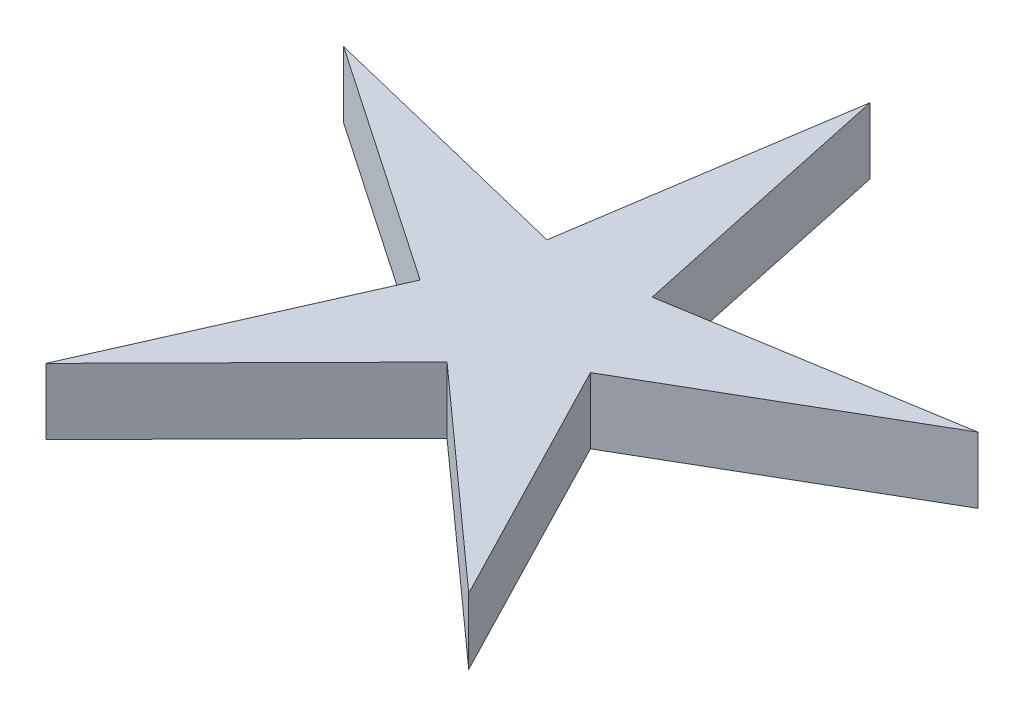
ISO-10303-21;
HEADER;
FILE_DESCRIPTION(('STEP AP214'),'2;1');
FILE_NAME('part.step','',(''),(''),'','','');
FILE_SCHEMA(('AUTOMOTIVE_DESIGN { 1 0 10303 214 1 1 1 1 }'));
ENDSEC;
DATA;
#1=APPLICATION_CONTEXT('core data for automotive mechanical design processes');
#2=APPLICATION_PROTOCOL_DEFINITION('international standard','automotive_design',2000,#1);
#3=PRODUCT_CONTEXT('',#1,'mechanical');
#4=PRODUCT('Part','Part','',(#3));
#5=PRODUCT_RELATED_PRODUCT_CATEGORY('part','',(#4));
#6=PRODUCT_DEFINITION_FORMATION('','',#4);
#7=PRODUCT_DEFINITION_CONTEXT('part definition',#1,'design');
#8=PRODUCT_DEFINITION('design','',#6,#7);
#9=PRODUCT_DEFINITION_SHAPE('','',#8);
#10=(LENGTH_UNIT() NAMED_UNIT(*) SI_UNIT(.MILLI.,.METRE.));
#11=(NAMED_UNIT(*) PLANE_ANGLE_UNIT() SI_UNIT($,.RADIAN.));
#12=(NAMED_UNIT(*) SI_UNIT($,.STERADIAN.) SOLID_ANGLE_UNIT());
#13=UNCERTAINTY_MEASURE_WITH_UNIT(LENGTH_MEASURE(1.E-05),#10,'distance_accuracy_value','');
#14=(GEOMETRIC_REPRESENTATION_CONTEXT(3) GLOBAL_UNCERTAINTY_ASSIGNED_CONTEXT((#13)) GLOBAL_UNIT_ASSIGNED_CONTEXT((#10,
#11,#12)) REPRESENTATION_CONTEXT('',''));
#15=CARTESIAN_POINT('',(0.,0.,0.));
#16=DIRECTION('',(0.,0.,1.));
#17=DIRECTION('',(1.,0.,0.));
#18=AXIS2_PLACEMENT_3D('',#15,#16,#17);
#19=CARTESIAN_POINT('',(66.4840473280508,10.,30.82949304793));
#20=DIRECTION('',(-0.888351621109785,0.,0.45916380222271));
#21=DIRECTION('',(0.45916380222271,0.,0.888351621109785));
#22=AXIS2_PLACEMENT_3D('',#19,#20,#21);
#23=PLANE('',#22);
#24=DIRECTION('',(-0.45916380222271,0.,-0.888351621109785));
#25=VECTOR('',#24,1.);
#26=CARTESIAN_POINT('',(66.4840473280508,0.,30.82949304793));
#27=LINE('',#26,#25);
#28=CARTESIAN_POINT('',(66.4840473280508,0.,30.82949304793));
#29=VERTEX_POINT('',#28);
#30=CARTESIAN_POINT('',(46.7631117785742,0.,-7.32491934340591));
#31=VERTEX_POINT('',#30);
#32=EDGE_CURVE('E156',#29,#31,#27,.T.);
#33=ORIENTED_EDGE('',*,*,#32,.T.);
#34=DIRECTION('',(0.,-1.,0.));
#35=VECTOR('',#34,1.);
#36=CARTESIAN_POINT('',(46.7631117785742,10.,-7.32491934340591));
#37=LINE('',#36,#35);
#38=CARTESIAN_POINT('',(46.7631117785742,10.,-7.32491934340591));
#39=VERTEX_POINT('',#38);
#40=EDGE_CURVE('E11',#39,#31,#37,.T.);
#41=ORIENTED_EDGE('',*,*,#40,.F.);
#42=DIRECTION('',(-0.45916380222271,0.,-0.888351621109785));
#43=VECTOR('',#42,1.);
#44=CARTESIAN_POINT('',(66.4840473280508,10.,30.82949304793));
#45=LINE('',#44,#43);
#46=CARTESIAN_POINT('',(66.4840473280508,10.,30.82949304793));
#47=VERTEX_POINT('',#46);
#48=EDGE_CURVE('E184',#47,#39,#45,.T.);
#49=ORIENTED_EDGE('',*,*,#48,.F.);
#50=DIRECTION('',(0.,-1.,0.));
#51=VECTOR('',#50,1.);
#52=CARTESIAN_POINT('',(66.4840473280508,10.,30.82949304793));
#53=LINE('',#52,#51);
#54=EDGE_CURVE('E152',#47,#29,#53,.T.);
#55=ORIENTED_EDGE('',*,*,#54,.T.);
#56=EDGE_LOOP('',(#33,#41,#49,#55));
#57=FACE_BOUND('',#56,.T.);
#58=ADVANCED_FACE('F43',(#57),#23,.F.);
#59=CARTESIAN_POINT('',(46.7631117785742,10.,-7.32491934340591));
#60=DIRECTION('',(-0.501563585968425,0.,-0.865120783030031));
#61=DIRECTION('',(-0.865120783030031,0.,0.501563585968425));
#62=AXIS2_PLACEMENT_3D('',#59,#60,#61);
#63=PLANE('',#62);
#64=DIRECTION('',(0.865120783030031,0.,-0.501563585968425));
#65=VECTOR('',#64,1.);
#66=CARTESIAN_POINT('',(46.7631117785742,0.,-7.32491934340591));
#67=LINE('',#66,#65);
#68=CARTESIAN_POINT('',(83.9197672511082,0.,-28.8669117760978));
#69=VERTEX_POINT('',#68);
#70=EDGE_CURVE('E160',#31,#69,#67,.T.);
#71=ORIENTED_EDGE('',*,*,#70,.T.);
#72=DIRECTION('',(0.,-1.,0.));
#73=VECTOR('',#72,1.);
#74=CARTESIAN_POINT('',(83.9197672511082,10.,-28.8669117760978));
#75=LINE('',#74,#73);
#76=CARTESIAN_POINT('',(83.9197672511082,10.,-28.8669117760978));
#77=VERTEX_POINT('',#76);
#78=EDGE_CURVE('E52',#77,#69,#75,.T.);
#79=ORIENTED_EDGE('',*,*,#78,.F.);
#80=DIRECTION('',(0.865120783030031,0.,-0.501563585968425));
#81=VECTOR('',#80,1.);
#82=CARTESIAN_POINT('',(46.7631117785742,10.,-7.32491934340591));
#83=LINE('',#82,#81);
#84=EDGE_CURVE('E109',#39,#77,#83,.T.);
#85=ORIENTED_EDGE('',*,*,#84,.F.);
#86=ORIENTED_EDGE('',*,*,#40,.T.);
#87=EDGE_LOOP('',(#71,#79,#85,#86));
#88=FACE_BOUND('',#87,.T.);
#89=ADVANCED_FACE('F248',(#88),#63,.F.);
#90=CARTESIAN_POINT('',(83.9197672511082,10.,-28.8669117760978));
#91=DIRECTION('',(0.16217497824731,0.,0.98676201610646));
#92=DIRECTION('',(0.98676201610646,0.,-0.16217497824731));
#93=AXIS2_PLACEMENT_3D('',#90,#91,#92);
#94=PLANE('',#93);
#95=DIRECTION('',(-0.98676201610646,0.,0.16217497824731));
#96=VECTOR('',#95,1.);
#97=CARTESIAN_POINT('',(83.9197672511082,0.,-28.8669117760978));
#98=LINE('',#97,#96);
#99=CARTESIAN_POINT('',(41.5386604911542,0.,-21.9015493536442));
#100=VERTEX_POINT('',#99);
#101=EDGE_CURVE('E163',#69,#100,#98,.T.);
#102=ORIENTED_EDGE('',*,*,#101,.T.);
#103=DIRECTION('',(0.,-1.,0.));
#104=VECTOR('',#103,1.);
#105=CARTESIAN_POINT('',(41.5386604911542,10.,-21.9015493536442));
#106=LINE('',#105,#104);
#107=CARTESIAN_POINT('',(41.5386604911542,10.,-21.9015493536442));
#108=VERTEX_POINT('',#107);
#109=EDGE_CURVE('E203',#108,#100,#106,.T.);
#110=ORIENTED_EDGE('',*,*,#109,.F.);
#111=DIRECTION('',(-0.98676201610646,0.,0.16217497824731));
#112=VECTOR('',#111,1.);
#113=CARTESIAN_POINT('',(83.9197672511082,10.,-28.8669117760978));
#114=LINE('',#113,#112);
#115=EDGE_CURVE('E213',#77,#108,#114,.T.);
#116=ORIENTED_EDGE('',*,*,#115,.F.);
#117=ORIENTED_EDGE('',*,*,#78,.T.);
#118=EDGE_LOOP('',(#102,#110,#116,#117));
#119=FACE_BOUND('',#118,.T.);
#120=ADVANCED_FACE('F211',(#119),#94,.F.);
#121=CARTESIAN_POINT('',(41.5386604911542,10.,-21.9015493536442));
#122=DIRECTION('',(-0.97777042990696,0.,0.209678292628393));
#123=DIRECTION('',(0.209678292628393,0.,0.97777042990696));
#124=AXIS2_PLACEMENT_3D('',#121,#122,#123);
#125=PLANE('',#124);
#126=DIRECTION('',(-0.209678292628393,0.,-0.97777042990696));
#127=VECTOR('',#126,1.);
#128=CARTESIAN_POINT('',(41.5386604911542,0.,-21.9015493536442));
#129=LINE('',#128,#127);
#130=CARTESIAN_POINT('',(32.5330462092096,0.,-63.8964704189299));
#131=VERTEX_POINT('',#130);
#132=EDGE_CURVE('E166',#100,#131,#129,.T.);
#133=ORIENTED_EDGE('',*,*,#132,.T.);
#134=DIRECTION('',(0.,-1.,0.));
#135=VECTOR('',#134,1.);
#136=CARTESIAN_POINT('',(32.5330462092096,10.,-63.8964704189299));
#137=LINE('',#136,#135);
#138=CARTESIAN_POINT('',(32.5330462092096,10.,-63.8964704189299));
#139=VERTEX_POINT('',#138);
#140=EDGE_CURVE('E199',#139,#131,#137,.T.);
#141=ORIENTED_EDGE('',*,*,#140,.F.);
#142=DIRECTION('',(-0.209678292628393,0.,-0.97777042990696));
#143=VECTOR('',#142,1.);
#144=CARTESIAN_POINT('',(41.5386604911542,10.,-21.9015493536442));
#145=LINE('',#144,#143);
#146=EDGE_CURVE('E232',#108,#139,#145,.T.);
#147=ORIENTED_EDGE('',*,*,#146,.F.);
#148=ORIENTED_EDGE('',*,*,#109,.T.);
#149=EDGE_LOOP('',(#133,#141,#147,#148));
#150=FACE_BOUND('',#149,.T.);
#151=ADVANCED_FACE('F222',(#150),#125,.F.);
#152=CARTESIAN_POINT('',(32.5330462092096,10.,-63.8964704189299));
#153=DIRECTION('',(0.988581269791398,0.,0.150688662538453));
#154=DIRECTION('',(0.150688662538453,0.,-0.988581269791398));
#155=AXIS2_PLACEMENT_3D('',#152,#153,#154);
#156=PLANE('',#155);
#157=DIRECTION('',(-0.150688662538453,0.,0.988581269791398));
#158=VECTOR('',#157,1.);
#159=CARTESIAN_POINT('',(32.5330462092096,0.,-63.8964704189299));
#160=LINE('',#159,#158);
#161=CARTESIAN_POINT('',(26.0610173001967,0.,-21.4372273065564));
#162=VERTEX_POINT('',#161);
#163=EDGE_CURVE('E169',#131,#162,#160,.T.);
#164=ORIENTED_EDGE('',*,*,#163,.T.);
#165=DIRECTION('',(0.,-1.,0.));
#166=VECTOR('',#165,1.);
#167=CARTESIAN_POINT('',(26.0610173001967,10.,-21.4372273065564));
#168=LINE('',#167,#166);
#169=CARTESIAN_POINT('',(26.0610173001967,10.,-21.4372273065564));
#170=VERTEX_POINT('',#169);
#171=EDGE_CURVE('E195',#170,#162,#168,.T.);
#172=ORIENTED_EDGE('',*,*,#171,.F.);
#173=DIRECTION('',(-0.150688662538453,0.,0.988581269791398));
#174=VECTOR('',#173,1.);
#175=CARTESIAN_POINT('',(32.5330462092096,10.,-63.8964704189299));
#176=LINE('',#175,#174);
#177=EDGE_CURVE('E228',#139,#170,#176,.T.);
#178=ORIENTED_EDGE('',*,*,#177,.F.);
#179=ORIENTED_EDGE('',*,*,#140,.T.);
#180=EDGE_LOOP('',(#164,#172,#178,#179));
#181=FACE_BOUND('',#180,.T.);
#182=ADVANCED_FACE('F226',(#181),#156,.F.);
#183=CARTESIAN_POINT('',(26.0610173001967,10.,-21.4372273065564));
#184=DIRECTION('',(-0.237430704479935,0.,0.971404478356036));
#185=DIRECTION('',(0.971404478356036,0.,0.237430704479935));
#186=AXIS2_PLACEMENT_3D('',#183,#184,#185);
#187=PLANE('',#186);
#188=DIRECTION('',(-0.971404478356036,0.,-0.237430704479935));
#189=VECTOR('',#188,1.);
#190=CARTESIAN_POINT('',(26.0610173001967,0.,-21.4372273065564));
#191=LINE('',#190,#189);
#192=CARTESIAN_POINT('',(-14.6990873678906,0.,-31.3998130076209));
#193=VERTEX_POINT('',#192);
#194=EDGE_CURVE('E172',#162,#193,#191,.T.);
#195=ORIENTED_EDGE('',*,*,#194,.T.);
#196=DIRECTION('',(0.,-1.,0.));
#197=VECTOR('',#196,1.);
#198=CARTESIAN_POINT('',(-14.6990873678906,10.,-31.3998130076209));
#199=LINE('',#198,#197);
#200=CARTESIAN_POINT('',(-14.6990873678906,10.,-31.3998130076209));
#201=VERTEX_POINT('',#200);
#202=EDGE_CURVE('E191',#201,#193,#199,.T.);
#203=ORIENTED_EDGE('',*,*,#202,.F.);
#204=DIRECTION('',(-0.971404478356036,0.,-0.237430704479935));
#205=VECTOR('',#204,1.);
#206=CARTESIAN_POINT('',(26.0610173001967,10.,-21.4372273065564));
#207=LINE('',#206,#205);
#208=EDGE_CURVE('E231',#170,#201,#207,.T.);
#209=ORIENTED_EDGE('',*,*,#208,.F.);
#210=ORIENTED_EDGE('',*,*,#171,.T.);
#211=EDGE_LOOP('',(#195,#203,#209,#210));
#212=FACE_BOUND('',#211,.T.);
#213=ADVANCED_FACE('F260',(#212),#187,.F.);
#214=CARTESIAN_POINT('',(-14.6990873678906,10.,-31.3998130076209));
#215=DIRECTION('',(0.563261718489381,0.,-0.826278546547343));
#216=DIRECTION('',(-0.826278546547343,0.,-0.563261718489381));
#217=AXIS2_PLACEMENT_3D('',#214,#215,#216);
#218=PLANE('',#217);
#219=DIRECTION('',(0.826278546547343,0.,0.563261718489381));
#220=VECTOR('',#219,1.);
#221=CARTESIAN_POINT('',(-14.6990873678906,0.,-31.3998130076209));
#222=LINE('',#221,#220);
#223=CARTESIAN_POINT('',(21.7197590298616,0.,-6.5736304894918));
#224=VERTEX_POINT('',#223);
#225=EDGE_CURVE('E175',#193,#224,#222,.T.);
#226=ORIENTED_EDGE('',*,*,#225,.T.);
#227=DIRECTION('',(0.,-1.,0.));
#228=VECTOR('',#227,1.);
#229=CARTESIAN_POINT('',(21.7197590298616,10.,-6.5736304894918));
#230=LINE('',#229,#228);
#231=CARTESIAN_POINT('',(21.7197590298616,10.,-6.5736304894918));
#232=VERTEX_POINT('',#231);
#233=EDGE_CURVE('E145',#232,#224,#230,.T.);
#234=ORIENTED_EDGE('',*,*,#233,.F.);
#235=DIRECTION('',(0.826278546547343,0.,0.563261718489381));
#236=VECTOR('',#235,1.);
#237=CARTESIAN_POINT('',(-14.6990873678906,10.,-31.3998130076209));
#238=LINE('',#237,#236);
#239=EDGE_CURVE('E134',#201,#232,#238,.T.);
#240=ORIENTED_EDGE('',*,*,#239,.F.);
#241=ORIENTED_EDGE('',*,*,#202,.T.);
#242=EDGE_LOOP('',(#226,#234,#240,#241));
#243=FACE_BOUND('',#242,.T.);
#244=ADVANCED_FACE('F263',(#243),#218,.F.);
#245=CARTESIAN_POINT('',(21.7197590298616,10.,-6.5736304894918));
#246=DIRECTION('',(0.914278702524864,0.,0.405085736739089));
#247=DIRECTION('',(0.405085736739089,0.,-0.914278702524864));
#248=AXIS2_PLACEMENT_3D('',#245,#246,#247);
#249=PLANE('',#248);
#250=DIRECTION('',(-0.405085736739089,0.,0.914278702524864));
#251=VECTOR('',#250,1.);
#252=CARTESIAN_POINT('',(21.7197590298616,0.,-6.5736304894918));
#253=LINE('',#252,#251);
#254=CARTESIAN_POINT('',(4.32145875537913,0.,32.6943415925203));
#255=VERTEX_POINT('',#254);
#256=EDGE_CURVE('E143',#224,#255,#253,.T.);
#257=ORIENTED_EDGE('',*,*,#256,.T.);
#258=DIRECTION('',(0.,-1.,0.));
#259=VECTOR('',#258,1.);
#260=CARTESIAN_POINT('',(4.32145875537913,10.,32.6943415925203));
#261=LINE('',#260,#259);
#262=CARTESIAN_POINT('',(4.32145875537913,10.,32.6943415925203));
#263=VERTEX_POINT('',#262);
#264=EDGE_CURVE('E140',#263,#255,#261,.T.);
#265=ORIENTED_EDGE('',*,*,#264,.F.);
#266=DIRECTION('',(-0.405085736739089,0.,0.914278702524864));
#267=VECTOR('',#266,1.);
#268=CARTESIAN_POINT('',(21.7197590298616,10.,-6.5736304894918));
#269=LINE('',#268,#267);
#270=EDGE_CURVE('E128',#232,#263,#269,.T.);
#271=ORIENTED_EDGE('',*,*,#270,.F.);
#272=ORIENTED_EDGE('',*,*,#233,.T.);
#273=EDGE_LOOP('',(#257,#265,#271,#272));
#274=FACE_BOUND('',#273,.T.);
#275=ADVANCED_FACE('F141',(#274),#249,.F.);
#276=CARTESIAN_POINT('',(4.32145875537913,10.,32.6943415925203));
#277=DIRECTION('',(-0.711206474054225,0.,-0.70298317992919));
#278=DIRECTION('',(-0.70298317992919,0.,0.711206474054226));
#279=AXIS2_PLACEMENT_3D('',#276,#277,#278);
#280=PLANE('',#279);
#281=DIRECTION('',(0.70298317992919,0.,-0.711206474054225));
#282=VECTOR('',#281,1.);
#283=CARTESIAN_POINT('',(4.32145875537913,0.,32.6943415925203));
#284=LINE('',#283,#282);
#285=CARTESIAN_POINT('',(34.5143570558104,0.,2.14825549144098));
#286=VERTEX_POINT('',#285);
#287=EDGE_CURVE('E95',#255,#286,#284,.T.);
#288=ORIENTED_EDGE('',*,*,#287,.T.);
#289=DIRECTION('',(0.,-1.,0.));
#290=VECTOR('',#289,1.);
#291=CARTESIAN_POINT('',(34.5143570558104,10.,2.14825549144098));
#292=LINE('',#291,#290);
#293=CARTESIAN_POINT('',(34.5143570558104,10.,2.14825549144098));
#294=VERTEX_POINT('',#293);
#295=EDGE_CURVE('E146',#294,#286,#292,.T.);
#296=ORIENTED_EDGE('',*,*,#295,.F.);
#297=DIRECTION('',(0.70298317992919,0.,-0.711206474054225));
#298=VECTOR('',#297,1.);
#299=CARTESIAN_POINT('',(4.32145875537913,10.,32.6943415925203));
#300=LINE('',#299,#298);
#301=EDGE_CURVE('E132',#263,#294,#300,.T.);
#302=ORIENTED_EDGE('',*,*,#301,.F.);
#303=ORIENTED_EDGE('',*,*,#264,.T.);
#304=EDGE_LOOP('',(#288,#296,#302,#303));
#305=FACE_BOUND('',#304,.T.);
#306=ADVANCED_FACE('F148',(#305),#280,.F.);
#307=CARTESIAN_POINT('',(34.5143570558104,10.,2.14825549144098));
#308=DIRECTION('',(0.667787086259194,0.,-0.744352340914876));
#309=DIRECTION('',(-0.744352340914876,0.,-0.667787086259194));
#310=AXIS2_PLACEMENT_3D('',#307,#308,#309);
#311=PLANE('',#310);
#312=DIRECTION('',(0.744352340914876,0.,0.667787086259194));
#313=VECTOR('',#312,1.);
#314=CARTESIAN_POINT('',(34.5143570558104,0.,2.14825549144098));
#315=LINE('',#314,#313);
#316=EDGE_CURVE('E101',#286,#29,#315,.T.);
#317=ORIENTED_EDGE('',*,*,#316,.T.);
#318=ORIENTED_EDGE('',*,*,#54,.F.);
#319=DIRECTION('',(0.744352340914876,0.,0.667787086259194));
#320=VECTOR('',#319,1.);
#321=CARTESIAN_POINT('',(34.5143570558104,10.,2.14825549144098));
#322=LINE('',#321,#320);
#323=EDGE_CURVE('E60',#294,#47,#322,.T.);
#324=ORIENTED_EDGE('',*,*,#323,.F.);
#325=ORIENTED_EDGE('',*,*,#295,.T.);
#326=EDGE_LOOP('',(#317,#318,#324,#325));
#327=FACE_BOUND('',#326,.T.);
#328=ADVANCED_FACE('F272',(#327),#311,.F.);
#329=CARTESIAN_POINT('',(0.,10.,0.));
#330=DIRECTION('',(0.,-1.,0.));
#331=DIRECTION('',(0.,0.,-1.));
#332=AXIS2_PLACEMENT_3D('',#329,#330,#331);
#333=PLANE('',#332);
#334=ORIENTED_EDGE('',*,*,#48,.T.);
#335=ORIENTED_EDGE('',*,*,#84,.T.);
#336=ORIENTED_EDGE('',*,*,#115,.T.);
#337=ORIENTED_EDGE('',*,*,#146,.T.);
#338=ORIENTED_EDGE('',*,*,#177,.T.);
#339=ORIENTED_EDGE('',*,*,#208,.T.);
#340=ORIENTED_EDGE('',*,*,#239,.T.);
#341=ORIENTED_EDGE('',*,*,#270,.T.);
#342=ORIENTED_EDGE('',*,*,#301,.T.);
#343=ORIENTED_EDGE('',*,*,#323,.T.);
#344=EDGE_LOOP('',(#334,#335,#336,#337,#338,#339,#340,#341,#342,#343));
#345=FACE_BOUND('',#344,.T.);
#346=ADVANCED_FACE('F130',(#345),#333,.F.);
#347=CARTESIAN_POINT('',(0.,0.,0.));
#348=DIRECTION('',(0.,-1.,0.));
#349=DIRECTION('',(0.,0.,-1.));
#350=AXIS2_PLACEMENT_3D('',#347,#348,#349);
#351=PLANE('',#350);
#352=ORIENTED_EDGE('',*,*,#32,.F.);
#353=ORIENTED_EDGE('',*,*,#316,.F.);
#354=ORIENTED_EDGE('',*,*,#287,.F.);
#355=ORIENTED_EDGE('',*,*,#256,.F.);
#356=ORIENTED_EDGE('',*,*,#225,.F.);
#357=ORIENTED_EDGE('',*,*,#194,.F.);
#358=ORIENTED_EDGE('',*,*,#163,.F.);
#359=ORIENTED_EDGE('',*,*,#132,.F.);
#360=ORIENTED_EDGE('',*,*,#101,.F.);
#361=ORIENTED_EDGE('',*,*,#70,.F.);
#362=EDGE_LOOP('',(#352,#353,#354,#355,#356,#357,#358,#359,#360,#361));
#363=FACE_BOUND('',#362,.T.);
#364=ADVANCED_FACE('F217',(#363),#351,.T.);
#365=CLOSED_SHELL('',(#58,#89,#120,#151,#182,#213,#244,#275,#306,#328,#346,#364));
#366=MANIFOLD_SOLID_BREP('B2',#365);
#367=ADVANCED_BREP_SHAPE_REPRESENTATION('',(#18,#366),#14);
#368=SHAPE_DEFINITION_REPRESENTATION(#9,#367);
ENDSEC;
END-ISO-10303-21;
